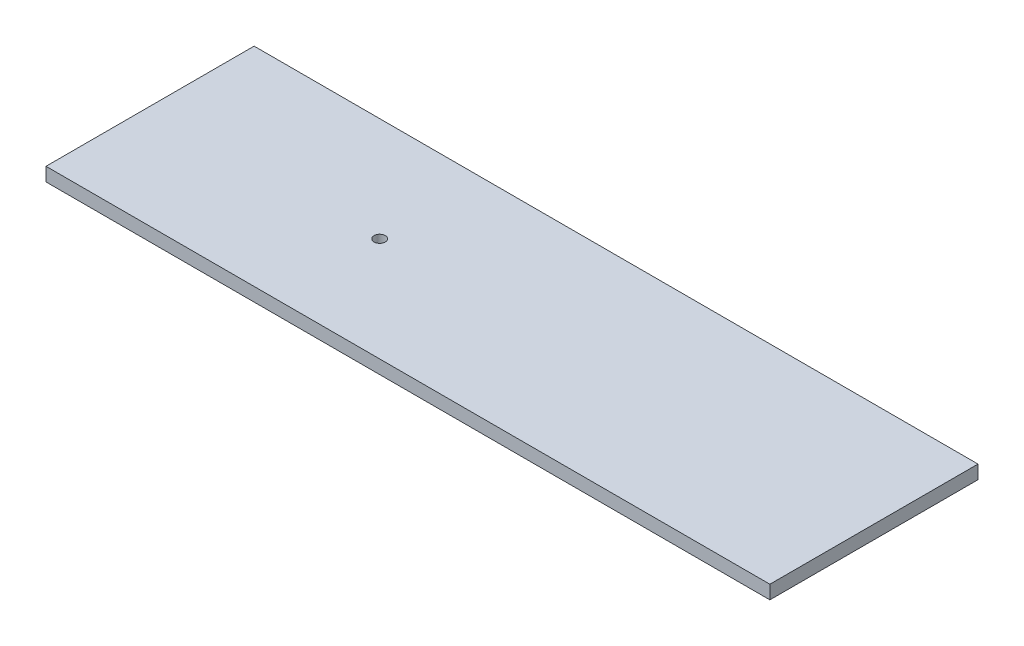
ISO-10303-21;
HEADER;
FILE_DESCRIPTION(('STEP AP214'),'2;1');
FILE_NAME('part.step','',(''),(''),'','','');
FILE_SCHEMA(('AUTOMOTIVE_DESIGN { 1 0 10303 214 1 1 1 1 }'));
ENDSEC;
DATA;
#1=APPLICATION_CONTEXT('core data for automotive mechanical design processes');
#2=APPLICATION_PROTOCOL_DEFINITION('international standard','automotive_design',2000,#1);
#3=PRODUCT_CONTEXT('',#1,'mechanical');
#4=PRODUCT('Part','Part','',(#3));
#5=PRODUCT_RELATED_PRODUCT_CATEGORY('part','',(#4));
#6=PRODUCT_DEFINITION_FORMATION('','',#4);
#7=PRODUCT_DEFINITION_CONTEXT('part definition',#1,'design');
#8=PRODUCT_DEFINITION('design','',#6,#7);
#9=PRODUCT_DEFINITION_SHAPE('','',#8);
#10=(LENGTH_UNIT() NAMED_UNIT(*) SI_UNIT(.MILLI.,.METRE.));
#11=(NAMED_UNIT(*) PLANE_ANGLE_UNIT() SI_UNIT($,.RADIAN.));
#12=(NAMED_UNIT(*) SI_UNIT($,.STERADIAN.) SOLID_ANGLE_UNIT());
#13=UNCERTAINTY_MEASURE_WITH_UNIT(LENGTH_MEASURE(1.E-05),#10,'distance_accuracy_value','');
#14=(GEOMETRIC_REPRESENTATION_CONTEXT(3) GLOBAL_UNCERTAINTY_ASSIGNED_CONTEXT((#13)) GLOBAL_UNIT_ASSIGNED_CONTEXT((#10,
#11,#12)) REPRESENTATION_CONTEXT('',''));
#15=CARTESIAN_POINT('',(0.,0.,0.));
#16=DIRECTION('',(0.,0.,1.));
#17=DIRECTION('',(1.,0.,0.));
#18=AXIS2_PLACEMENT_3D('',#15,#16,#17);
#19=CARTESIAN_POINT('',(-200.,3.75,-57.5));
#20=DIRECTION('',(1.,0.,0.));
#21=DIRECTION('',(0.,0.,-1.));
#22=AXIS2_PLACEMENT_3D('',#19,#20,#21);
#23=PLANE('',#22);
#24=DIRECTION('',(0.,0.,1.));
#25=VECTOR('',#24,1.);
#26=CARTESIAN_POINT('',(-200.,-3.75,-57.5));
#27=LINE('',#26,#25);
#28=CARTESIAN_POINT('',(-200.,-3.75,-57.5));
#29=VERTEX_POINT('',#28);
#30=CARTESIAN_POINT('',(-200.,-3.75,57.5));
#31=VERTEX_POINT('',#30);
#32=EDGE_CURVE('E101',#29,#31,#27,.T.);
#33=ORIENTED_EDGE('',*,*,#32,.T.);
#34=DIRECTION('',(0.,-1.,0.));
#35=VECTOR('',#34,1.);
#36=CARTESIAN_POINT('',(-200.,3.75,57.5));
#37=LINE('',#36,#35);
#38=CARTESIAN_POINT('',(-200.,3.75,57.5));
#39=VERTEX_POINT('',#38);
#40=EDGE_CURVE('E11',#39,#31,#37,.T.);
#41=ORIENTED_EDGE('',*,*,#40,.F.);
#42=DIRECTION('',(0.,0.,1.));
#43=VECTOR('',#42,1.);
#44=CARTESIAN_POINT('',(-200.,3.75,-57.5));
#45=LINE('',#44,#43);
#46=CARTESIAN_POINT('',(-200.,3.75,-57.5));
#47=VERTEX_POINT('',#46);
#48=EDGE_CURVE('E89',#47,#39,#45,.T.);
#49=ORIENTED_EDGE('',*,*,#48,.F.);
#50=DIRECTION('',(0.,-1.,0.));
#51=VECTOR('',#50,1.);
#52=CARTESIAN_POINT('',(-200.,3.75,-57.5));
#53=LINE('',#52,#51);
#54=EDGE_CURVE('E97',#47,#29,#53,.T.);
#55=ORIENTED_EDGE('',*,*,#54,.T.);
#56=EDGE_LOOP('',(#33,#41,#49,#55));
#57=FACE_BOUND('',#56,.T.);
#58=ADVANCED_FACE('F38',(#57),#23,.F.);
#59=CARTESIAN_POINT('',(-200.,3.75,57.5));
#60=DIRECTION('',(0.,0.,-1.));
#61=DIRECTION('',(-1.,0.,0.));
#62=AXIS2_PLACEMENT_3D('',#59,#60,#61);
#63=PLANE('',#62);
#64=DIRECTION('',(1.,0.,0.));
#65=VECTOR('',#64,1.);
#66=CARTESIAN_POINT('',(-200.,-3.75,57.5));
#67=LINE('',#66,#65);
#68=CARTESIAN_POINT('',(200.,-3.75,57.5));
#69=VERTEX_POINT('',#68);
#70=EDGE_CURVE('E93',#31,#69,#67,.T.);
#71=ORIENTED_EDGE('',*,*,#70,.T.);
#72=DIRECTION('',(0.,-1.,0.));
#73=VECTOR('',#72,1.);
#74=CARTESIAN_POINT('',(200.,3.75,57.5));
#75=LINE('',#74,#73);
#76=CARTESIAN_POINT('',(200.,3.75,57.5));
#77=VERTEX_POINT('',#76);
#78=EDGE_CURVE('E46',#77,#69,#75,.T.);
#79=ORIENTED_EDGE('',*,*,#78,.F.);
#80=DIRECTION('',(1.,0.,0.));
#81=VECTOR('',#80,1.);
#82=CARTESIAN_POINT('',(-200.,3.75,57.5));
#83=LINE('',#82,#81);
#84=EDGE_CURVE('E84',#39,#77,#83,.T.);
#85=ORIENTED_EDGE('',*,*,#84,.F.);
#86=ORIENTED_EDGE('',*,*,#40,.T.);
#87=EDGE_LOOP('',(#71,#79,#85,#86));
#88=FACE_BOUND('',#87,.T.);
#89=ADVANCED_FACE('F92',(#88),#63,.F.);
#90=CARTESIAN_POINT('',(200.,3.75,-57.5));
#91=DIRECTION('',(-1.,0.,0.));
#92=DIRECTION('',(0.,0.,1.));
#93=AXIS2_PLACEMENT_3D('',#90,#91,#92);
#94=PLANE('',#93);
#95=DIRECTION('',(0.,0.,-1.));
#96=VECTOR('',#95,1.);
#97=CARTESIAN_POINT('',(200.,-3.75,-57.5));
#98=LINE('',#97,#96);
#99=CARTESIAN_POINT('',(200.,-3.75,-57.5));
#100=VERTEX_POINT('',#99);
#101=EDGE_CURVE('E71',#69,#100,#98,.T.);
#102=ORIENTED_EDGE('',*,*,#101,.T.);
#103=DIRECTION('',(0.,-1.,0.));
#104=VECTOR('',#103,1.);
#105=CARTESIAN_POINT('',(200.,3.75,-57.5));
#106=LINE('',#105,#104);
#107=CARTESIAN_POINT('',(200.,3.75,-57.5));
#108=VERTEX_POINT('',#107);
#109=EDGE_CURVE('E94',#108,#100,#106,.T.);
#110=ORIENTED_EDGE('',*,*,#109,.F.);
#111=DIRECTION('',(0.,0.,-1.));
#112=VECTOR('',#111,1.);
#113=CARTESIAN_POINT('',(200.,3.75,-57.5));
#114=LINE('',#113,#112);
#115=EDGE_CURVE('E87',#77,#108,#114,.T.);
#116=ORIENTED_EDGE('',*,*,#115,.F.);
#117=ORIENTED_EDGE('',*,*,#78,.T.);
#118=EDGE_LOOP('',(#102,#110,#116,#117));
#119=FACE_BOUND('',#118,.T.);
#120=ADVANCED_FACE('F95',(#119),#94,.F.);
#121=CARTESIAN_POINT('',(-200.,3.75,-57.5));
#122=DIRECTION('',(0.,0.,1.));
#123=DIRECTION('',(1.,0.,0.));
#124=AXIS2_PLACEMENT_3D('',#121,#122,#123);
#125=PLANE('',#124);
#126=DIRECTION('',(-1.,0.,0.));
#127=VECTOR('',#126,1.);
#128=CARTESIAN_POINT('',(-200.,-3.75,-57.5));
#129=LINE('',#128,#127);
#130=EDGE_CURVE('E77',#100,#29,#129,.T.);
#131=ORIENTED_EDGE('',*,*,#130,.T.);
#132=ORIENTED_EDGE('',*,*,#54,.F.);
#133=DIRECTION('',(-1.,0.,0.));
#134=VECTOR('',#133,1.);
#135=CARTESIAN_POINT('',(-200.,3.75,-57.5));
#136=LINE('',#135,#134);
#137=EDGE_CURVE('E54',#108,#47,#136,.T.);
#138=ORIENTED_EDGE('',*,*,#137,.F.);
#139=ORIENTED_EDGE('',*,*,#109,.T.);
#140=EDGE_LOOP('',(#131,#132,#138,#139));
#141=FACE_BOUND('',#140,.T.);
#142=ADVANCED_FACE('F109',(#141),#125,.F.);
#143=CARTESIAN_POINT('',(0.,3.75,0.));
#144=DIRECTION('',(0.,1.,0.));
#145=DIRECTION('',(0.,0.,1.));
#146=AXIS2_PLACEMENT_3D('',#143,#144,#145);
#147=PLANE('',#146);
#148=CARTESIAN_POINT('',(-73.1,3.75,0.));
#149=DIRECTION('',(0.,1.,0.));
#150=DIRECTION('',(0.,0.,1.));
#151=AXIS2_PLACEMENT_3D('',#148,#149,#150);
#152=CIRCLE('',#151,3.1);
#153=CARTESIAN_POINT('',(-73.1,3.75,3.1));
#154=VERTEX_POINT('',#153);
#155=EDGE_CURVE('E115',#154,#154,#152,.T.);
#156=ORIENTED_EDGE('',*,*,#155,.F.);
#157=EDGE_LOOP('',(#156));
#158=FACE_BOUND('',#157,.T.);
#159=ORIENTED_EDGE('',*,*,#48,.T.);
#160=ORIENTED_EDGE('',*,*,#84,.T.);
#161=ORIENTED_EDGE('',*,*,#115,.T.);
#162=ORIENTED_EDGE('',*,*,#137,.T.);
#163=EDGE_LOOP('',(#159,#160,#161,#162));
#164=FACE_BOUND('',#163,.T.);
#165=ADVANCED_FACE('F85',(#158,#164),#147,.T.);
#166=CARTESIAN_POINT('',(0.,-3.75,0.));
#167=DIRECTION('',(0.,1.,0.));
#168=DIRECTION('',(0.,0.,1.));
#169=AXIS2_PLACEMENT_3D('',#166,#167,#168);
#170=PLANE('',#169);
#171=CARTESIAN_POINT('',(-73.1,-3.75,0.));
#172=DIRECTION('',(0.,1.,0.));
#173=DIRECTION('',(0.,0.,1.));
#174=AXIS2_PLACEMENT_3D('',#171,#172,#173);
#175=CIRCLE('',#174,3.1);
#176=CARTESIAN_POINT('',(-73.1,-3.75,3.1));
#177=VERTEX_POINT('',#176);
#178=EDGE_CURVE('E104',#177,#177,#175,.T.);
#179=ORIENTED_EDGE('',*,*,#178,.T.);
#180=EDGE_LOOP('',(#179));
#181=FACE_BOUND('',#180,.T.);
#182=ORIENTED_EDGE('',*,*,#32,.F.);
#183=ORIENTED_EDGE('',*,*,#130,.F.);
#184=ORIENTED_EDGE('',*,*,#101,.F.);
#185=ORIENTED_EDGE('',*,*,#70,.F.);
#186=EDGE_LOOP('',(#182,#183,#184,#185));
#187=FACE_BOUND('',#186,.T.);
#188=ADVANCED_FACE('F112',(#181,#187),#170,.F.);
#189=CARTESIAN_POINT('',(-73.1,-3.75,0.));
#190=DIRECTION('',(0.,1.,0.));
#191=DIRECTION('',(0.,0.,1.));
#192=AXIS2_PLACEMENT_3D('',#189,#190,#191);
#193=CYLINDRICAL_SURFACE('',#192,3.1);
#194=ORIENTED_EDGE('',*,*,#178,.F.);
#195=EDGE_LOOP('',(#194));
#196=FACE_BOUND('',#195,.T.);
#197=ORIENTED_EDGE('',*,*,#155,.T.);
#198=EDGE_LOOP('',(#197));
#199=FACE_BOUND('',#198,.T.);
#200=ADVANCED_FACE('F122',(#196,#199),#193,.F.);
#201=CLOSED_SHELL('',(#58,#89,#120,#142,#165,#188,#200));
#202=MANIFOLD_SOLID_BREP('B2',#201);
#203=ADVANCED_BREP_SHAPE_REPRESENTATION('',(#18,#202),#14);
#204=SHAPE_DEFINITION_REPRESENTATION(#9,#203);
ENDSEC;
END-ISO-10303-21;
